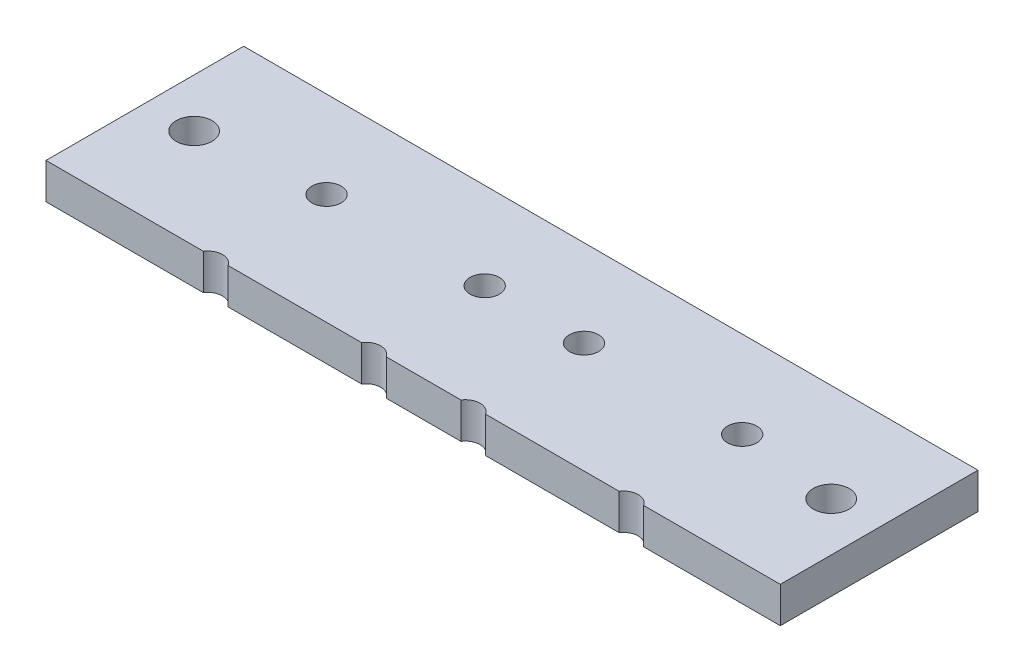
ISO-10303-21;
HEADER;
FILE_DESCRIPTION(('STEP AP214'),'2;1');
FILE_NAME('part.step','',(''),(''),'','','');
FILE_SCHEMA(('AUTOMOTIVE_DESIGN { 1 0 10303 214 1 1 1 1 }'));
ENDSEC;
DATA;
#1=APPLICATION_CONTEXT('core data for automotive mechanical design processes');
#2=APPLICATION_PROTOCOL_DEFINITION('international standard','automotive_design',2000,#1);
#3=PRODUCT_CONTEXT('',#1,'mechanical');
#4=PRODUCT('Part','Part','',(#3));
#5=PRODUCT_RELATED_PRODUCT_CATEGORY('part','',(#4));
#6=PRODUCT_DEFINITION_FORMATION('','',#4);
#7=PRODUCT_DEFINITION_CONTEXT('part definition',#1,'design');
#8=PRODUCT_DEFINITION('design','',#6,#7);
#9=PRODUCT_DEFINITION_SHAPE('','',#8);
#10=(LENGTH_UNIT() NAMED_UNIT(*) SI_UNIT(.MILLI.,.METRE.));
#11=(NAMED_UNIT(*) PLANE_ANGLE_UNIT() SI_UNIT($,.RADIAN.));
#12=(NAMED_UNIT(*) SI_UNIT($,.STERADIAN.) SOLID_ANGLE_UNIT());
#13=UNCERTAINTY_MEASURE_WITH_UNIT(LENGTH_MEASURE(1.E-05),#10,'distance_accuracy_value','');
#14=(GEOMETRIC_REPRESENTATION_CONTEXT(3) GLOBAL_UNCERTAINTY_ASSIGNED_CONTEXT((#13)) GLOBAL_UNIT_ASSIGNED_CONTEXT((#10,
#11,#12)) REPRESENTATION_CONTEXT('',''));
#15=CARTESIAN_POINT('',(0.,0.,0.));
#16=DIRECTION('',(0.,0.,1.));
#17=DIRECTION('',(1.,0.,0.));
#18=AXIS2_PLACEMENT_3D('',#15,#16,#17);
#19=CARTESIAN_POINT('',(0.,6.35,35.));
#20=DIRECTION('',(0.,0.,-1.));
#21=DIRECTION('',(-1.,0.,0.));
#22=AXIS2_PLACEMENT_3D('',#19,#20,#21);
#23=PLANE('',#22);
#24=DIRECTION('',(1.,0.,0.));
#25=VECTOR('',#24,1.);
#26=CARTESIAN_POINT('',(0.,6.35,35.));
#27=LINE('',#26,#25);
#28=CARTESIAN_POINT('',(32.2374009336524,6.35,35.));
#29=VERTEX_POINT('',#28);
#30=CARTESIAN_POINT('',(55.8829557012349,6.35,35.));
#31=VERTEX_POINT('',#30);
#32=EDGE_CURVE('E153',#29,#31,#27,.T.);
#33=ORIENTED_EDGE('',*,*,#32,.F.);
#34=DIRECTION('',(0.,-1.,0.));
#35=VECTOR('',#34,1.);
#36=CARTESIAN_POINT('',(32.2374009336524,6.35,35.));
#37=LINE('',#36,#35);
#38=CARTESIAN_POINT('',(32.2374009336524,0.,35.));
#39=VERTEX_POINT('',#38);
#40=EDGE_CURVE('E207',#29,#39,#37,.T.);
#41=ORIENTED_EDGE('',*,*,#40,.T.);
#42=DIRECTION('',(1.,0.,0.));
#43=VECTOR('',#42,1.);
#44=CARTESIAN_POINT('',(0.,0.,35.));
#45=LINE('',#44,#43);
#46=CARTESIAN_POINT('',(55.8829557012349,0.,35.));
#47=VERTEX_POINT('',#46);
#48=EDGE_CURVE('E174',#39,#47,#45,.T.);
#49=ORIENTED_EDGE('',*,*,#48,.T.);
#50=DIRECTION('',(0.,-1.,0.));
#51=VECTOR('',#50,1.);
#52=CARTESIAN_POINT('',(55.8829557012349,6.35,35.));
#53=LINE('',#52,#51);
#54=EDGE_CURVE('E205',#47,#31,#53,.F.);
#55=ORIENTED_EDGE('',*,*,#54,.T.);
#56=EDGE_LOOP('',(#33,#41,#49,#55));
#57=FACE_BOUND('',#56,.T.);
#58=ADVANCED_FACE('F39',(#57),#23,.F.);
#59=CARTESIAN_POINT('',(60.2374009336524,6.35,35.));
#60=VERTEX_POINT('',#59);
#61=CARTESIAN_POINT('',(73.464907828623,6.35,35.));
#62=VERTEX_POINT('',#61);
#63=EDGE_CURVE('E146',#60,#62,#27,.T.);
#64=ORIENTED_EDGE('',*,*,#63,.F.);
#65=DIRECTION('',(0.,-1.,0.));
#66=VECTOR('',#65,1.);
#67=CARTESIAN_POINT('',(60.2374009336524,6.35,35.));
#68=LINE('',#67,#66);
#69=CARTESIAN_POINT('',(60.2374009336524,0.,35.));
#70=VERTEX_POINT('',#69);
#71=EDGE_CURVE('E265',#60,#70,#68,.T.);
#72=ORIENTED_EDGE('',*,*,#71,.T.);
#73=CARTESIAN_POINT('',(73.464907828623,0.,35.));
#74=VERTEX_POINT('',#73);
#75=EDGE_CURVE('E198',#70,#74,#45,.T.);
#76=ORIENTED_EDGE('',*,*,#75,.T.);
#77=DIRECTION('',(0.,-1.,0.));
#78=VECTOR('',#77,1.);
#79=CARTESIAN_POINT('',(73.464907828623,6.35,35.));
#80=LINE('',#79,#78);
#81=EDGE_CURVE('E62',#74,#62,#80,.F.);
#82=ORIENTED_EDGE('',*,*,#81,.T.);
#83=EDGE_LOOP('',(#64,#72,#76,#82));
#84=FACE_BOUND('',#83,.T.);
#85=ADVANCED_FACE('F301',(#84),#23,.F.);
#86=CARTESIAN_POINT('',(105.819353061041,6.35,35.));
#87=VERTEX_POINT('',#86);
#88=CARTESIAN_POINT('',(130.,6.35,35.));
#89=VERTEX_POINT('',#88);
#90=EDGE_CURVE('E151',#87,#89,#27,.T.);
#91=ORIENTED_EDGE('',*,*,#90,.F.);
#92=DIRECTION('',(0.,-1.,0.));
#93=VECTOR('',#92,1.);
#94=CARTESIAN_POINT('',(105.819353061041,6.35,35.));
#95=LINE('',#94,#93);
#96=CARTESIAN_POINT('',(105.819353061041,0.,35.));
#97=VERTEX_POINT('',#96);
#98=EDGE_CURVE('E217',#87,#97,#95,.T.);
#99=ORIENTED_EDGE('',*,*,#98,.T.);
#100=CARTESIAN_POINT('',(130.,0.,35.));
#101=VERTEX_POINT('',#100);
#102=EDGE_CURVE('E168',#97,#101,#45,.T.);
#103=ORIENTED_EDGE('',*,*,#102,.T.);
#104=DIRECTION('',(0.,-1.,0.));
#105=VECTOR('',#104,1.);
#106=CARTESIAN_POINT('',(130.,6.35,35.));
#107=LINE('',#106,#105);
#108=EDGE_CURVE('E183',#89,#101,#107,.T.);
#109=ORIENTED_EDGE('',*,*,#108,.F.);
#110=EDGE_LOOP('',(#91,#99,#103,#109));
#111=FACE_BOUND('',#110,.T.);
#112=ADVANCED_FACE('F215',(#111),#23,.F.);
#113=CARTESIAN_POINT('',(77.8193530610405,0.,35.));
#114=VERTEX_POINT('',#113);
#115=CARTESIAN_POINT('',(101.464907828623,0.,35.));
#116=VERTEX_POINT('',#115);
#117=EDGE_CURVE('E208',#114,#116,#45,.T.);
#118=ORIENTED_EDGE('',*,*,#117,.T.);
#119=DIRECTION('',(0.,-1.,0.));
#120=VECTOR('',#119,1.);
#121=CARTESIAN_POINT('',(101.464907828623,6.35,35.));
#122=LINE('',#121,#120);
#123=CARTESIAN_POINT('',(101.464907828623,6.35,35.));
#124=VERTEX_POINT('',#123);
#125=EDGE_CURVE('E54',#116,#124,#122,.F.);
#126=ORIENTED_EDGE('',*,*,#125,.T.);
#127=CARTESIAN_POINT('',(77.8193530610405,6.35,35.));
#128=VERTEX_POINT('',#127);
#129=EDGE_CURVE('E143',#128,#124,#27,.T.);
#130=ORIENTED_EDGE('',*,*,#129,.F.);
#131=DIRECTION('',(0.,-1.,0.));
#132=VECTOR('',#131,1.);
#133=CARTESIAN_POINT('',(77.8193530610405,6.35,35.));
#134=LINE('',#133,#132);
#135=EDGE_CURVE('E126',#128,#114,#134,.T.);
#136=ORIENTED_EDGE('',*,*,#135,.T.);
#137=EDGE_LOOP('',(#118,#126,#130,#136));
#138=FACE_BOUND('',#137,.T.);
#139=ADVANCED_FACE('F150',(#138),#23,.F.);
#140=CARTESIAN_POINT('',(0.,6.35,0.));
#141=DIRECTION('',(1.,0.,0.));
#142=DIRECTION('',(0.,0.,-1.));
#143=AXIS2_PLACEMENT_3D('',#140,#141,#142);
#144=PLANE('',#143);
#145=DIRECTION('',(0.,0.,1.));
#146=VECTOR('',#145,1.);
#147=CARTESIAN_POINT('',(0.,0.,0.));
#148=LINE('',#147,#146);
#149=CARTESIAN_POINT('',(0.,0.,0.));
#150=VERTEX_POINT('',#149);
#151=CARTESIAN_POINT('',(0.,0.,35.));
#152=VERTEX_POINT('',#151);
#153=EDGE_CURVE('E165',#150,#152,#148,.T.);
#154=ORIENTED_EDGE('',*,*,#153,.T.);
#155=DIRECTION('',(0.,-1.,0.));
#156=VECTOR('',#155,1.);
#157=CARTESIAN_POINT('',(0.,6.35,35.));
#158=LINE('',#157,#156);
#159=CARTESIAN_POINT('',(0.,6.35,35.));
#160=VERTEX_POINT('',#159);
#161=EDGE_CURVE('E186',#160,#152,#158,.T.);
#162=ORIENTED_EDGE('',*,*,#161,.F.);
#163=DIRECTION('',(0.,0.,1.));
#164=VECTOR('',#163,1.);
#165=CARTESIAN_POINT('',(0.,6.35,0.));
#166=LINE('',#165,#164);
#167=CARTESIAN_POINT('',(0.,6.35,0.));
#168=VERTEX_POINT('',#167);
#169=EDGE_CURVE('E154',#168,#160,#166,.T.);
#170=ORIENTED_EDGE('',*,*,#169,.F.);
#171=DIRECTION('',(0.,-1.,0.));
#172=VECTOR('',#171,1.);
#173=CARTESIAN_POINT('',(0.,6.35,0.));
#174=LINE('',#173,#172);
#175=EDGE_CURVE('E164',#168,#150,#174,.T.);
#176=ORIENTED_EDGE('',*,*,#175,.T.);
#177=EDGE_LOOP('',(#154,#162,#170,#176));
#178=FACE_BOUND('',#177,.T.);
#179=ADVANCED_FACE('F41',(#178),#144,.F.);
#180=CARTESIAN_POINT('',(27.8829557012349,0.,35.));
#181=VERTEX_POINT('',#180);
#182=EDGE_CURVE('E170',#152,#181,#45,.T.);
#183=ORIENTED_EDGE('',*,*,#182,.T.);
#184=DIRECTION('',(0.,-1.,0.));
#185=VECTOR('',#184,1.);
#186=CARTESIAN_POINT('',(27.8829557012349,6.35,35.));
#187=LINE('',#186,#185);
#188=CARTESIAN_POINT('',(27.8829557012349,6.35,35.));
#189=VERTEX_POINT('',#188);
#190=EDGE_CURVE('E267',#181,#189,#187,.F.);
#191=ORIENTED_EDGE('',*,*,#190,.T.);
#192=EDGE_CURVE('E155',#160,#189,#27,.T.);
#193=ORIENTED_EDGE('',*,*,#192,.F.);
#194=ORIENTED_EDGE('',*,*,#161,.T.);
#195=EDGE_LOOP('',(#183,#191,#193,#194));
#196=FACE_BOUND('',#195,.T.);
#197=ADVANCED_FACE('F302',(#196),#23,.F.);
#198=CARTESIAN_POINT('',(130.,6.35,0.));
#199=DIRECTION('',(-1.,0.,0.));
#200=DIRECTION('',(0.,0.,1.));
#201=AXIS2_PLACEMENT_3D('',#198,#199,#200);
#202=PLANE('',#201);
#203=DIRECTION('',(0.,0.,-1.));
#204=VECTOR('',#203,1.);
#205=CARTESIAN_POINT('',(130.,0.,0.));
#206=LINE('',#205,#204);
#207=CARTESIAN_POINT('',(130.,0.,0.));
#208=VERTEX_POINT('',#207);
#209=EDGE_CURVE('E173',#101,#208,#206,.T.);
#210=ORIENTED_EDGE('',*,*,#209,.T.);
#211=DIRECTION('',(0.,-1.,0.));
#212=VECTOR('',#211,1.);
#213=CARTESIAN_POINT('',(130.,6.35,0.));
#214=LINE('',#213,#212);
#215=CARTESIAN_POINT('',(130.,6.35,0.));
#216=VERTEX_POINT('',#215);
#217=EDGE_CURVE('E180',#216,#208,#214,.T.);
#218=ORIENTED_EDGE('',*,*,#217,.F.);
#219=DIRECTION('',(0.,0.,-1.));
#220=VECTOR('',#219,1.);
#221=CARTESIAN_POINT('',(130.,6.35,0.));
#222=LINE('',#221,#220);
#223=EDGE_CURVE('E159',#89,#216,#222,.T.);
#224=ORIENTED_EDGE('',*,*,#223,.F.);
#225=ORIENTED_EDGE('',*,*,#108,.T.);
#226=EDGE_LOOP('',(#210,#218,#224,#225));
#227=FACE_BOUND('',#226,.T.);
#228=ADVANCED_FACE('F220',(#227),#202,.F.);
#229=CARTESIAN_POINT('',(0.,6.35,0.));
#230=DIRECTION('',(0.,0.,1.));
#231=DIRECTION('',(1.,0.,0.));
#232=AXIS2_PLACEMENT_3D('',#229,#230,#231);
#233=PLANE('',#232);
#234=DIRECTION('',(-1.,0.,0.));
#235=VECTOR('',#234,1.);
#236=CARTESIAN_POINT('',(0.,0.,0.));
#237=LINE('',#236,#235);
#238=EDGE_CURVE('E176',#208,#150,#237,.T.);
#239=ORIENTED_EDGE('',*,*,#238,.T.);
#240=ORIENTED_EDGE('',*,*,#175,.F.);
#241=DIRECTION('',(-1.,0.,0.));
#242=VECTOR('',#241,1.);
#243=CARTESIAN_POINT('',(0.,6.35,0.));
#244=LINE('',#243,#242);
#245=EDGE_CURVE('E162',#216,#168,#244,.T.);
#246=ORIENTED_EDGE('',*,*,#245,.F.);
#247=ORIENTED_EDGE('',*,*,#217,.T.);
#248=EDGE_LOOP('',(#239,#240,#246,#247));
#249=FACE_BOUND('',#248,.T.);
#250=ADVANCED_FACE('F226',(#249),#233,.F.);
#251=CARTESIAN_POINT('',(0.,6.35,0.));
#252=DIRECTION('',(0.,1.,0.));
#253=DIRECTION('',(0.,0.,1.));
#254=AXIS2_PLACEMENT_3D('',#251,#252,#253);
#255=PLANE('',#254);
#256=CARTESIAN_POINT('',(30.0601783174436,6.35,36.396500763108));
#257=DIRECTION('',(0.,-1.,0.));
#258=DIRECTION('',(0.,0.,-1.));
#259=AXIS2_PLACEMENT_3D('',#256,#257,#258);
#260=CIRCLE('',#259,2.58660254037844);
#261=EDGE_CURVE('E240',#189,#29,#260,.T.);
#262=ORIENTED_EDGE('',*,*,#261,.T.);
#263=ORIENTED_EDGE('',*,*,#32,.T.);
#264=CARTESIAN_POINT('',(58.0601783174436,6.35,36.396500763108));
#265=DIRECTION('',(0.,-1.,0.));
#266=DIRECTION('',(0.,0.,-1.));
#267=AXIS2_PLACEMENT_3D('',#264,#265,#266);
#268=CIRCLE('',#267,2.58660254037844);
#269=EDGE_CURVE('E243',#31,#60,#268,.T.);
#270=ORIENTED_EDGE('',*,*,#269,.T.);
#271=ORIENTED_EDGE('',*,*,#63,.T.);
#272=CARTESIAN_POINT('',(75.6421304448317,6.35,36.396500763108));
#273=DIRECTION('',(0.,-1.,0.));
#274=DIRECTION('',(0.,0.,-1.));
#275=AXIS2_PLACEMENT_3D('',#272,#273,#274);
#276=CIRCLE('',#275,2.58660254037844);
#277=EDGE_CURVE('E129',#62,#128,#276,.T.);
#278=ORIENTED_EDGE('',*,*,#277,.T.);
#279=ORIENTED_EDGE('',*,*,#129,.T.);
#280=CARTESIAN_POINT('',(103.642130444832,6.35,36.396500763108));
#281=DIRECTION('',(0.,-1.,0.));
#282=DIRECTION('',(0.,0.,-1.));
#283=AXIS2_PLACEMENT_3D('',#280,#281,#282);
#284=CIRCLE('',#283,2.58660254037844);
#285=EDGE_CURVE('E232',#124,#87,#284,.T.);
#286=ORIENTED_EDGE('',*,*,#285,.T.);
#287=ORIENTED_EDGE('',*,*,#90,.T.);
#288=ORIENTED_EDGE('',*,*,#223,.T.);
#289=ORIENTED_EDGE('',*,*,#245,.T.);
#290=ORIENTED_EDGE('',*,*,#169,.T.);
#291=ORIENTED_EDGE('',*,*,#192,.T.);
#292=EDGE_LOOP('',(#262,#263,#270,#271,#278,#279,#286,#287,#288,#289,#290,#291));
#293=FACE_BOUND('',#292,.T.);
#294=CARTESIAN_POINT('',(58.0601783174436,6.35,15.396500763108));
#295=DIRECTION('',(0.,-1.,0.));
#296=DIRECTION('',(0.,0.,-1.));
#297=AXIS2_PLACEMENT_3D('',#294,#295,#296);
#298=CIRCLE('',#297,2.58660254037844);
#299=CARTESIAN_POINT('',(58.0601783174436,6.35,12.8098982227296));
#300=VERTEX_POINT('',#299);
#301=EDGE_CURVE('E248',#300,#300,#298,.T.);
#302=ORIENTED_EDGE('',*,*,#301,.T.);
#303=EDGE_LOOP('',(#302));
#304=FACE_BOUND('',#303,.T.);
#305=CARTESIAN_POINT('',(75.6421304448317,6.35,15.396500763108));
#306=DIRECTION('',(0.,-1.,0.));
#307=DIRECTION('',(0.,0.,-1.));
#308=AXIS2_PLACEMENT_3D('',#305,#306,#307);
#309=CIRCLE('',#308,2.58660254037844);
#310=CARTESIAN_POINT('',(75.6421304448317,6.35,12.8098982227296));
#311=VERTEX_POINT('',#310);
#312=EDGE_CURVE('E147',#311,#311,#309,.T.);
#313=ORIENTED_EDGE('',*,*,#312,.T.);
#314=EDGE_LOOP('',(#313));
#315=FACE_BOUND('',#314,.T.);
#316=CARTESIAN_POINT('',(103.642130444832,6.35,15.396500763108));
#317=DIRECTION('',(0.,-1.,0.));
#318=DIRECTION('',(0.,0.,-1.));
#319=AXIS2_PLACEMENT_3D('',#316,#317,#318);
#320=CIRCLE('',#319,2.58660254037844);
#321=CARTESIAN_POINT('',(103.642130444832,6.35,12.8098982227296));
#322=VERTEX_POINT('',#321);
#323=EDGE_CURVE('E233',#322,#322,#320,.T.);
#324=ORIENTED_EDGE('',*,*,#323,.T.);
#325=EDGE_LOOP('',(#324));
#326=FACE_BOUND('',#325,.T.);
#327=CARTESIAN_POINT('',(30.0601783174436,6.35,15.396500763108));
#328=DIRECTION('',(0.,-1.,0.));
#329=DIRECTION('',(0.,0.,-1.));
#330=AXIS2_PLACEMENT_3D('',#327,#328,#329);
#331=CIRCLE('',#330,2.58660254037844);
#332=CARTESIAN_POINT('',(30.0601783174436,6.35,12.8098982227296));
#333=VERTEX_POINT('',#332);
#334=EDGE_CURVE('E256',#333,#333,#331,.T.);
#335=ORIENTED_EDGE('',*,*,#334,.T.);
#336=EDGE_LOOP('',(#335));
#337=FACE_BOUND('',#336,.T.);
#338=CARTESIAN_POINT('',(8.605,6.35,17.3826032724338));
#339=DIRECTION('',(0.,1.,0.));
#340=DIRECTION('',(0.,0.,1.));
#341=AXIS2_PLACEMENT_3D('',#338,#339,#340);
#342=CIRCLE('',#341,3.18);
#343=CARTESIAN_POINT('',(8.605,6.35,20.5626032724338));
#344=VERTEX_POINT('',#343);
#345=EDGE_CURVE('E274',#344,#344,#342,.T.);
#346=ORIENTED_EDGE('',*,*,#345,.F.);
#347=EDGE_LOOP('',(#346));
#348=FACE_BOUND('',#347,.T.);
#349=CARTESIAN_POINT('',(121.395,6.35,17.3826032724338));
#350=DIRECTION('',(0.,1.,0.));
#351=DIRECTION('',(0.,0.,1.));
#352=AXIS2_PLACEMENT_3D('',#349,#350,#351);
#353=CIRCLE('',#352,3.18000000000002);
#354=CARTESIAN_POINT('',(121.395,6.35,20.5626032724338));
#355=VERTEX_POINT('',#354);
#356=EDGE_CURVE('E277',#355,#355,#353,.T.);
#357=ORIENTED_EDGE('',*,*,#356,.F.);
#358=EDGE_LOOP('',(#357));
#359=FACE_BOUND('',#358,.T.);
#360=ADVANCED_FACE('F140',(#293,#304,#315,#326,#337,#348,#359),#255,.T.);
#361=CARTESIAN_POINT('',(0.,0.,0.));
#362=DIRECTION('',(0.,1.,0.));
#363=DIRECTION('',(0.,0.,1.));
#364=AXIS2_PLACEMENT_3D('',#361,#362,#363);
#365=PLANE('',#364);
#366=CARTESIAN_POINT('',(58.0601783174436,0.,15.396500763108));
#367=DIRECTION('',(0.,-1.,0.));
#368=DIRECTION('',(0.,0.,-1.));
#369=AXIS2_PLACEMENT_3D('',#366,#367,#368);
#370=CIRCLE('',#369,2.58660254037844);
#371=CARTESIAN_POINT('',(58.0601783174436,0.,12.8098982227296));
#372=VERTEX_POINT('',#371);
#373=EDGE_CURVE('E245',#372,#372,#370,.T.);
#374=ORIENTED_EDGE('',*,*,#373,.F.);
#375=EDGE_LOOP('',(#374));
#376=FACE_BOUND('',#375,.T.);
#377=CARTESIAN_POINT('',(75.6421304448317,0.,15.396500763108));
#378=DIRECTION('',(0.,-1.,0.));
#379=DIRECTION('',(0.,0.,-1.));
#380=AXIS2_PLACEMENT_3D('',#377,#378,#379);
#381=CIRCLE('',#380,2.58660254037844);
#382=CARTESIAN_POINT('',(75.6421304448317,0.,12.8098982227296));
#383=VERTEX_POINT('',#382);
#384=EDGE_CURVE('E251',#383,#383,#381,.T.);
#385=ORIENTED_EDGE('',*,*,#384,.F.);
#386=EDGE_LOOP('',(#385));
#387=FACE_BOUND('',#386,.T.);
#388=CARTESIAN_POINT('',(103.642130444832,0.,15.396500763108));
#389=DIRECTION('',(0.,-1.,0.));
#390=DIRECTION('',(0.,0.,-1.));
#391=AXIS2_PLACEMENT_3D('',#388,#389,#390);
#392=CIRCLE('',#391,2.58660254037844);
#393=CARTESIAN_POINT('',(103.642130444832,0.,12.8098982227296));
#394=VERTEX_POINT('',#393);
#395=EDGE_CURVE('E148',#394,#394,#392,.T.);
#396=ORIENTED_EDGE('',*,*,#395,.F.);
#397=EDGE_LOOP('',(#396));
#398=FACE_BOUND('',#397,.T.);
#399=CARTESIAN_POINT('',(30.0601783174436,0.,15.396500763108));
#400=DIRECTION('',(0.,-1.,0.));
#401=DIRECTION('',(0.,0.,-1.));
#402=AXIS2_PLACEMENT_3D('',#399,#400,#401);
#403=CIRCLE('',#402,2.58660254037844);
#404=CARTESIAN_POINT('',(30.0601783174436,0.,12.8098982227296));
#405=VERTEX_POINT('',#404);
#406=EDGE_CURVE('E242',#405,#405,#403,.T.);
#407=ORIENTED_EDGE('',*,*,#406,.F.);
#408=EDGE_LOOP('',(#407));
#409=FACE_BOUND('',#408,.T.);
#410=CARTESIAN_POINT('',(8.605,0.,17.3826032724338));
#411=DIRECTION('',(0.,1.,0.));
#412=DIRECTION('',(0.,0.,1.));
#413=AXIS2_PLACEMENT_3D('',#410,#411,#412);
#414=CIRCLE('',#413,3.18);
#415=CARTESIAN_POINT('',(8.605,0.,20.5626032724338));
#416=VERTEX_POINT('',#415);
#417=EDGE_CURVE('E169',#416,#416,#414,.T.);
#418=ORIENTED_EDGE('',*,*,#417,.T.);
#419=EDGE_LOOP('',(#418));
#420=FACE_BOUND('',#419,.T.);
#421=CARTESIAN_POINT('',(121.395,0.,17.3826032724338));
#422=DIRECTION('',(0.,1.,0.));
#423=DIRECTION('',(0.,0.,1.));
#424=AXIS2_PLACEMENT_3D('',#421,#422,#423);
#425=CIRCLE('',#424,3.18000000000002);
#426=CARTESIAN_POINT('',(121.395,0.,20.5626032724338));
#427=VERTEX_POINT('',#426);
#428=EDGE_CURVE('E271',#427,#427,#425,.T.);
#429=ORIENTED_EDGE('',*,*,#428,.T.);
#430=EDGE_LOOP('',(#429));
#431=FACE_BOUND('',#430,.T.);
#432=ORIENTED_EDGE('',*,*,#48,.F.);
#433=CARTESIAN_POINT('',(30.0601783174436,0.,36.396500763108));
#434=DIRECTION('',(0.,1.,0.));
#435=DIRECTION('',(0.,0.,1.));
#436=AXIS2_PLACEMENT_3D('',#433,#434,#435);
#437=CIRCLE('',#436,2.58660254037844);
#438=EDGE_CURVE('E11',#39,#181,#437,.T.);
#439=ORIENTED_EDGE('',*,*,#438,.T.);
#440=ORIENTED_EDGE('',*,*,#182,.F.);
#441=ORIENTED_EDGE('',*,*,#153,.F.);
#442=ORIENTED_EDGE('',*,*,#238,.F.);
#443=ORIENTED_EDGE('',*,*,#209,.F.);
#444=ORIENTED_EDGE('',*,*,#102,.F.);
#445=CARTESIAN_POINT('',(103.642130444832,0.,36.396500763108));
#446=DIRECTION('',(0.,1.,0.));
#447=DIRECTION('',(0.,0.,1.));
#448=AXIS2_PLACEMENT_3D('',#445,#446,#447);
#449=CIRCLE('',#448,2.58660254037844);
#450=EDGE_CURVE('E190',#97,#116,#449,.T.);
#451=ORIENTED_EDGE('',*,*,#450,.T.);
#452=ORIENTED_EDGE('',*,*,#117,.F.);
#453=CARTESIAN_POINT('',(75.6421304448317,0.,36.396500763108));
#454=DIRECTION('',(0.,1.,0.));
#455=DIRECTION('',(0.,0.,1.));
#456=AXIS2_PLACEMENT_3D('',#453,#454,#455);
#457=CIRCLE('',#456,2.58660254037844);
#458=EDGE_CURVE('E130',#114,#74,#457,.T.);
#459=ORIENTED_EDGE('',*,*,#458,.T.);
#460=ORIENTED_EDGE('',*,*,#75,.F.);
#461=CARTESIAN_POINT('',(58.0601783174436,0.,36.396500763108));
#462=DIRECTION('',(0.,1.,0.));
#463=DIRECTION('',(0.,0.,1.));
#464=AXIS2_PLACEMENT_3D('',#461,#462,#463);
#465=CIRCLE('',#464,2.58660254037844);
#466=EDGE_CURVE('E47',#70,#47,#465,.T.);
#467=ORIENTED_EDGE('',*,*,#466,.T.);
#468=EDGE_LOOP('',(#432,#439,#440,#441,#442,#443,#444,#451,#452,#459,#460,#467));
#469=FACE_BOUND('',#468,.T.);
#470=ADVANCED_FACE('F196',(#376,#387,#398,#409,#420,#431,#469),#365,.F.);
#471=CARTESIAN_POINT('',(121.395,0.,17.3826032724338));
#472=DIRECTION('',(0.,1.,0.));
#473=DIRECTION('',(0.,0.,1.));
#474=AXIS2_PLACEMENT_3D('',#471,#472,#473);
#475=CYLINDRICAL_SURFACE('',#474,3.18000000000002);
#476=ORIENTED_EDGE('',*,*,#428,.F.);
#477=EDGE_LOOP('',(#476));
#478=FACE_BOUND('',#477,.T.);
#479=ORIENTED_EDGE('',*,*,#356,.T.);
#480=EDGE_LOOP('',(#479));
#481=FACE_BOUND('',#480,.T.);
#482=ADVANCED_FACE('F283',(#478,#481),#475,.F.);
#483=CARTESIAN_POINT('',(8.605,0.,17.3826032724338));
#484=DIRECTION('',(0.,1.,0.));
#485=DIRECTION('',(0.,0.,1.));
#486=AXIS2_PLACEMENT_3D('',#483,#484,#485);
#487=CYLINDRICAL_SURFACE('',#486,3.18);
#488=ORIENTED_EDGE('',*,*,#417,.F.);
#489=EDGE_LOOP('',(#488));
#490=FACE_BOUND('',#489,.T.);
#491=ORIENTED_EDGE('',*,*,#345,.T.);
#492=EDGE_LOOP('',(#491));
#493=FACE_BOUND('',#492,.T.);
#494=ADVANCED_FACE('F286',(#490,#493),#487,.F.);
#495=CARTESIAN_POINT('',(30.0601783174436,6.35,15.396500763108));
#496=DIRECTION('',(0.,-1.,0.));
#497=DIRECTION('',(0.,0.,-1.));
#498=AXIS2_PLACEMENT_3D('',#495,#496,#497);
#499=CYLINDRICAL_SURFACE('',#498,2.58660254037844);
#500=ORIENTED_EDGE('',*,*,#334,.F.);
#501=EDGE_LOOP('',(#500));
#502=FACE_BOUND('',#501,.T.);
#503=ORIENTED_EDGE('',*,*,#406,.T.);
#504=EDGE_LOOP('',(#503));
#505=FACE_BOUND('',#504,.T.);
#506=ADVANCED_FACE('F336',(#502,#505),#499,.F.);
#507=CARTESIAN_POINT('',(75.6421304448317,6.35,36.396500763108));
#508=DIRECTION('',(0.,-1.,0.));
#509=DIRECTION('',(0.,0.,-1.));
#510=AXIS2_PLACEMENT_3D('',#507,#508,#509);
#511=CYLINDRICAL_SURFACE('',#510,2.58660254037844);
#512=ORIENTED_EDGE('',*,*,#277,.F.);
#513=ORIENTED_EDGE('',*,*,#81,.F.);
#514=ORIENTED_EDGE('',*,*,#458,.F.);
#515=ORIENTED_EDGE('',*,*,#135,.F.);
#516=EDGE_LOOP('',(#512,#513,#514,#515));
#517=FACE_BOUND('',#516,.T.);
#518=ADVANCED_FACE('F128',(#517),#511,.F.);
#519=CARTESIAN_POINT('',(103.642130444832,6.35,15.396500763108));
#520=DIRECTION('',(0.,-1.,0.));
#521=DIRECTION('',(0.,0.,-1.));
#522=AXIS2_PLACEMENT_3D('',#519,#520,#521);
#523=CYLINDRICAL_SURFACE('',#522,2.58660254037844);
#524=ORIENTED_EDGE('',*,*,#323,.F.);
#525=EDGE_LOOP('',(#524));
#526=FACE_BOUND('',#525,.T.);
#527=ORIENTED_EDGE('',*,*,#395,.T.);
#528=EDGE_LOOP('',(#527));
#529=FACE_BOUND('',#528,.T.);
#530=ADVANCED_FACE('F348',(#526,#529),#523,.F.);
#531=CARTESIAN_POINT('',(103.642130444832,6.35,36.396500763108));
#532=DIRECTION('',(0.,-1.,0.));
#533=DIRECTION('',(0.,0.,-1.));
#534=AXIS2_PLACEMENT_3D('',#531,#532,#533);
#535=CYLINDRICAL_SURFACE('',#534,2.58660254037844);
#536=ORIENTED_EDGE('',*,*,#285,.F.);
#537=ORIENTED_EDGE('',*,*,#125,.F.);
#538=ORIENTED_EDGE('',*,*,#450,.F.);
#539=ORIENTED_EDGE('',*,*,#98,.F.);
#540=EDGE_LOOP('',(#536,#537,#538,#539));
#541=FACE_BOUND('',#540,.T.);
#542=ADVANCED_FACE('F356',(#541),#535,.F.);
#543=CARTESIAN_POINT('',(75.6421304448317,6.35,15.396500763108));
#544=DIRECTION('',(0.,-1.,0.));
#545=DIRECTION('',(0.,0.,-1.));
#546=AXIS2_PLACEMENT_3D('',#543,#544,#545);
#547=CYLINDRICAL_SURFACE('',#546,2.58660254037844);
#548=ORIENTED_EDGE('',*,*,#312,.F.);
#549=EDGE_LOOP('',(#548));
#550=FACE_BOUND('',#549,.T.);
#551=ORIENTED_EDGE('',*,*,#384,.T.);
#552=EDGE_LOOP('',(#551));
#553=FACE_BOUND('',#552,.T.);
#554=ADVANCED_FACE('F365',(#550,#553),#547,.F.);
#555=CARTESIAN_POINT('',(58.0601783174436,6.35,15.396500763108));
#556=DIRECTION('',(0.,-1.,0.));
#557=DIRECTION('',(0.,0.,-1.));
#558=AXIS2_PLACEMENT_3D('',#555,#556,#557);
#559=CYLINDRICAL_SURFACE('',#558,2.58660254037844);
#560=ORIENTED_EDGE('',*,*,#301,.F.);
#561=EDGE_LOOP('',(#560));
#562=FACE_BOUND('',#561,.T.);
#563=ORIENTED_EDGE('',*,*,#373,.T.);
#564=EDGE_LOOP('',(#563));
#565=FACE_BOUND('',#564,.T.);
#566=ADVANCED_FACE('F373',(#562,#565),#559,.F.);
#567=CARTESIAN_POINT('',(58.0601783174436,6.35,36.396500763108));
#568=DIRECTION('',(0.,-1.,0.));
#569=DIRECTION('',(0.,0.,-1.));
#570=AXIS2_PLACEMENT_3D('',#567,#568,#569);
#571=CYLINDRICAL_SURFACE('',#570,2.58660254037844);
#572=ORIENTED_EDGE('',*,*,#269,.F.);
#573=ORIENTED_EDGE('',*,*,#54,.F.);
#574=ORIENTED_EDGE('',*,*,#466,.F.);
#575=ORIENTED_EDGE('',*,*,#71,.F.);
#576=EDGE_LOOP('',(#572,#573,#574,#575));
#577=FACE_BOUND('',#576,.T.);
#578=ADVANCED_FACE('F382',(#577),#571,.F.);
#579=CARTESIAN_POINT('',(30.0601783174436,6.35,36.396500763108));
#580=DIRECTION('',(0.,-1.,0.));
#581=DIRECTION('',(0.,0.,-1.));
#582=AXIS2_PLACEMENT_3D('',#579,#580,#581);
#583=CYLINDRICAL_SURFACE('',#582,2.58660254037844);
#584=ORIENTED_EDGE('',*,*,#261,.F.);
#585=ORIENTED_EDGE('',*,*,#190,.F.);
#586=ORIENTED_EDGE('',*,*,#438,.F.);
#587=ORIENTED_EDGE('',*,*,#40,.F.);
#588=EDGE_LOOP('',(#584,#585,#586,#587));
#589=FACE_BOUND('',#588,.T.);
#590=ADVANCED_FACE('F391',(#589),#583,.F.);
#591=CLOSED_SHELL('',(#58,#85,#112,#139,#179,#197,#228,#250,#360,#470,#482,#494,#506,#518,#530,
#542,#554,#566,#578,#590));
#592=MANIFOLD_SOLID_BREP('B2',#591);
#593=ADVANCED_BREP_SHAPE_REPRESENTATION('',(#18,#592),#14);
#594=SHAPE_DEFINITION_REPRESENTATION(#9,#593);
ENDSEC;
END-ISO-10303-21;
